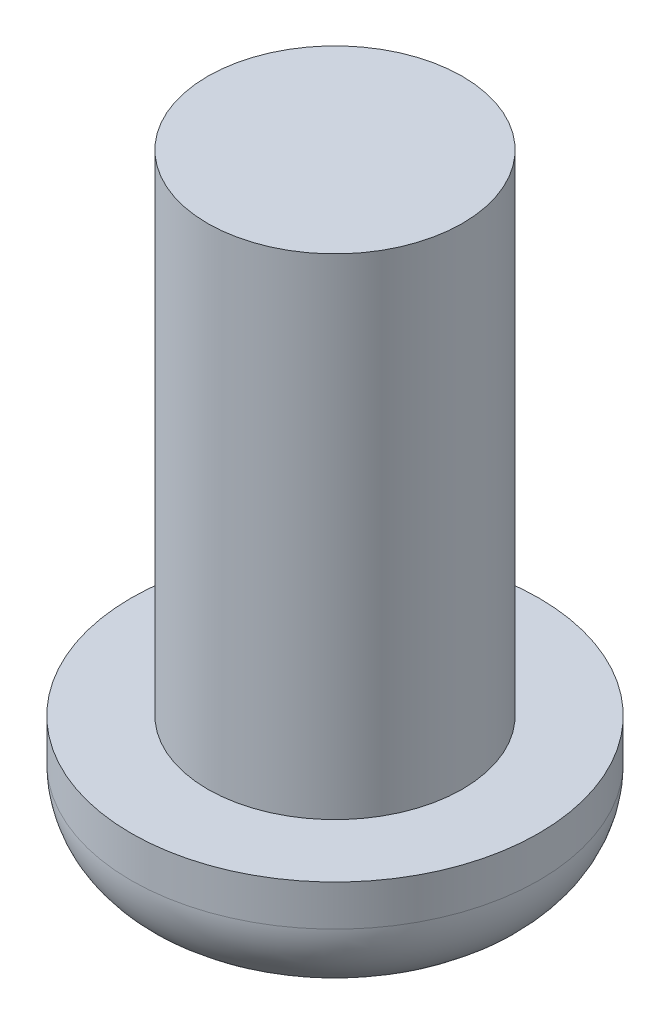
ISO-10303-21;
HEADER;
FILE_DESCRIPTION(('STEP AP214'),'2;1');
FILE_NAME('part.step','',(''),(''),'','','');
FILE_SCHEMA(('AUTOMOTIVE_DESIGN { 1 0 10303 214 1 1 1 1 }'));
ENDSEC;
DATA;
#1=APPLICATION_CONTEXT('core data for automotive mechanical design processes');
#2=APPLICATION_PROTOCOL_DEFINITION('international standard','automotive_design',2000,#1);
#3=PRODUCT_CONTEXT('',#1,'mechanical');
#4=PRODUCT('Part','Part','',(#3));
#5=PRODUCT_RELATED_PRODUCT_CATEGORY('part','',(#4));
#6=PRODUCT_DEFINITION_FORMATION('','',#4);
#7=PRODUCT_DEFINITION_CONTEXT('part definition',#1,'design');
#8=PRODUCT_DEFINITION('design','',#6,#7);
#9=PRODUCT_DEFINITION_SHAPE('','',#8);
#10=(LENGTH_UNIT() NAMED_UNIT(*) SI_UNIT(.MILLI.,.METRE.));
#11=(NAMED_UNIT(*) PLANE_ANGLE_UNIT() SI_UNIT($,.RADIAN.));
#12=(NAMED_UNIT(*) SI_UNIT($,.STERADIAN.) SOLID_ANGLE_UNIT());
#13=UNCERTAINTY_MEASURE_WITH_UNIT(LENGTH_MEASURE(1.E-05),#10,'distance_accuracy_value','');
#14=(GEOMETRIC_REPRESENTATION_CONTEXT(3) GLOBAL_UNCERTAINTY_ASSIGNED_CONTEXT((#13)) GLOBAL_UNIT_ASSIGNED_CONTEXT((#10,
#11,#12)) REPRESENTATION_CONTEXT('',''));
#15=CARTESIAN_POINT('',(0.,0.,0.));
#16=DIRECTION('',(0.,0.,1.));
#17=DIRECTION('',(1.,0.,0.));
#18=AXIS2_PLACEMENT_3D('',#15,#16,#17);
#19=CARTESIAN_POINT('',(0.,9.525,0.));
#20=DIRECTION('',(0.,-1.,0.));
#21=DIRECTION('',(0.,0.,-1.));
#22=AXIS2_PLACEMENT_3D('',#19,#20,#21);
#23=CYLINDRICAL_SURFACE('',#22,2.4765);
#24=CARTESIAN_POINT('',(0.,9.525,0.));
#25=DIRECTION('',(0.,1.,0.));
#26=DIRECTION('',(0.,0.,1.));
#27=AXIS2_PLACEMENT_3D('',#24,#25,#26);
#28=CIRCLE('',#27,2.4765);
#29=CARTESIAN_POINT('',(0.,9.525,-2.4765));
#30=VERTEX_POINT('',#29);
#31=EDGE_CURVE('E174',#30,#30,#28,.T.);
#32=CARTESIAN_POINT('',(0.,0.,0.));
#33=DIRECTION('',(0.,1.,0.));
#34=DIRECTION('',(0.,0.,1.));
#35=AXIS2_PLACEMENT_3D('',#32,#33,#34);
#36=CIRCLE('',#35,2.4765);
#37=CARTESIAN_POINT('',(0.,0.,-2.4765));
#38=VERTEX_POINT('',#37);
#39=EDGE_CURVE('E173',#38,#38,#36,.T.);
#40=CARTESIAN_POINT('',(0.,9.525,-2.4765));
#41=CARTESIAN_POINT('',(0.,9.42578125,-2.4765));
#42=CARTESIAN_POINT('',(0.,9.3265625,-2.4765));
#43=CARTESIAN_POINT('',(0.,9.128125,-2.4765));
#44=CARTESIAN_POINT('',(0.,9.02890625,-2.4765));
#45=CARTESIAN_POINT('',(0.,8.83046875,-2.4765));
#46=CARTESIAN_POINT('',(0.,8.73125,-2.4765));
#47=CARTESIAN_POINT('',(0.,8.5328125,-2.4765));
#48=CARTESIAN_POINT('',(0.,8.43359375,-2.4765));
#49=CARTESIAN_POINT('',(0.,8.23515625,-2.4765));
#50=CARTESIAN_POINT('',(0.,8.1359375,-2.4765));
#51=CARTESIAN_POINT('',(0.,7.9375,-2.4765));
#52=CARTESIAN_POINT('',(0.,7.83828125,-2.4765));
#53=CARTESIAN_POINT('',(0.,7.63984375,-2.4765));
#54=CARTESIAN_POINT('',(0.,7.540625,-2.4765));
#55=CARTESIAN_POINT('',(0.,7.3421875,-2.4765));
#56=CARTESIAN_POINT('',(0.,7.24296875,-2.4765));
#57=CARTESIAN_POINT('',(0.,7.04453125,-2.4765));
#58=CARTESIAN_POINT('',(0.,6.9453125,-2.4765));
#59=CARTESIAN_POINT('',(0.,6.746875,-2.4765));
#60=CARTESIAN_POINT('',(0.,6.64765625,-2.4765));
#61=CARTESIAN_POINT('',(0.,6.44921875,-2.4765));
#62=CARTESIAN_POINT('',(0.,6.35,-2.4765));
#63=CARTESIAN_POINT('',(0.,6.1515625,-2.4765));
#64=CARTESIAN_POINT('',(0.,6.05234375,-2.4765));
#65=CARTESIAN_POINT('',(0.,5.85390625,-2.4765));
#66=CARTESIAN_POINT('',(0.,5.7546875,-2.4765));
#67=CARTESIAN_POINT('',(0.,5.55625,-2.4765));
#68=CARTESIAN_POINT('',(0.,5.45703125,-2.4765));
#69=CARTESIAN_POINT('',(0.,5.25859375,-2.4765));
#70=CARTESIAN_POINT('',(0.,5.159375,-2.4765));
#71=CARTESIAN_POINT('',(0.,4.9609375,-2.4765));
#72=CARTESIAN_POINT('',(0.,4.86171875,-2.4765));
#73=CARTESIAN_POINT('',(0.,4.66328125,-2.4765));
#74=CARTESIAN_POINT('',(0.,4.5640625,-2.4765));
#75=CARTESIAN_POINT('',(0.,4.365625,-2.4765));
#76=CARTESIAN_POINT('',(0.,4.26640625,-2.4765));
#77=CARTESIAN_POINT('',(0.,4.06796875,-2.4765));
#78=CARTESIAN_POINT('',(0.,3.96875,-2.4765));
#79=CARTESIAN_POINT('',(0.,3.7703125,-2.4765));
#80=CARTESIAN_POINT('',(0.,3.67109375,-2.4765));
#81=CARTESIAN_POINT('',(0.,3.47265625,-2.4765));
#82=CARTESIAN_POINT('',(0.,3.3734375,-2.4765));
#83=CARTESIAN_POINT('',(0.,3.175,-2.4765));
#84=CARTESIAN_POINT('',(0.,3.07578125,-2.4765));
#85=CARTESIAN_POINT('',(0.,2.87734375,-2.4765));
#86=CARTESIAN_POINT('',(0.,2.778125,-2.4765));
#87=CARTESIAN_POINT('',(0.,2.5796875,-2.4765));
#88=CARTESIAN_POINT('',(0.,2.48046875,-2.4765));
#89=CARTESIAN_POINT('',(0.,2.28203125,-2.4765));
#90=CARTESIAN_POINT('',(0.,2.1828125,-2.4765));
#91=CARTESIAN_POINT('',(0.,1.984375,-2.4765));
#92=CARTESIAN_POINT('',(0.,1.88515625,-2.4765));
#93=CARTESIAN_POINT('',(0.,1.68671875,-2.4765));
#94=CARTESIAN_POINT('',(0.,1.5875,-2.4765));
#95=CARTESIAN_POINT('',(0.,1.3890625,-2.4765));
#96=CARTESIAN_POINT('',(0.,1.28984375,-2.4765));
#97=CARTESIAN_POINT('',(0.,1.09140625,-2.4765));
#98=CARTESIAN_POINT('',(0.,0.992187500000001,-2.4765));
#99=CARTESIAN_POINT('',(0.,0.793750000000001,-2.4765));
#100=CARTESIAN_POINT('',(0.,0.69453125,-2.4765));
#101=CARTESIAN_POINT('',(0.,0.49609375,-2.4765));
#102=CARTESIAN_POINT('',(0.,0.396875,-2.4765));
#103=CARTESIAN_POINT('',(0.,0.1984375,-2.4765));
#104=CARTESIAN_POINT('',(0.,0.0992187500000001,-2.4765));
#105=CARTESIAN_POINT('',(0.,0.,-2.4765));
#106=B_SPLINE_CURVE_WITH_KNOTS('',3,(#40,#41,#42,#43,#44,#45,#46,#47,#48,#49,#50,#51,#52,#53,
#54,#55,#56,#57,#58,#59,#60,#61,#62,#63,#64,#65,#66,#67,#68,#69,#70,#71,#72,#73,#74,#75,#76,#77,
#78,#79,#80,#81,#82,#83,#84,#85,#86,#87,#88,#89,#90,#91,#92,#93,#94,#95,#96,#97,#98,#99,#100,
#101,#102,#103,#104,#105),.UNSPECIFIED.,.F.,.F.,(4,2,2,2,2,2,2,2,2,2,2,2,2,2,2,2,2,2,2,2,2,2,2,
2,2,2,2,2,2,2,2,2,4),(0.,0.297656249999998,0.595312499999999,0.892968749999999,1.190625,
1.48828125,1.7859375,2.08359375,2.38125,2.67890625,2.9765625,3.27421875,3.571875,3.86953125,
4.1671875,4.46484375,4.7625,5.06015625,5.3578125,5.65546875,5.953125,6.25078125,6.5484375,
6.84609375,7.14375,7.44140625,7.7390625,8.03671875,8.334375,8.63203125,8.9296875,9.22734375,
9.525),.UNSPECIFIED.);
#107=EDGE_CURVE('BSEAM45',#30,#38,#106,.T.);
#108=ORIENTED_EDGE('',*,*,#31,.F.);
#109=ORIENTED_EDGE('',*,*,#39,.T.);
#110=ORIENTED_EDGE('',*,*,#107,.T.);
#111=ORIENTED_EDGE('',*,*,#107,.F.);
#112=EDGE_LOOP('',(#108,#110,#109,#111));
#113=FACE_BOUND('',#112,.T.);
#114=ADVANCED_FACE('F45',(#113),#23,.T.);
#115=CARTESIAN_POINT('',(0.,9.525,0.));
#116=DIRECTION('',(0.,1.,0.));
#117=DIRECTION('',(0.,0.,1.));
#118=AXIS2_PLACEMENT_3D('',#115,#116,#117);
#119=PLANE('',#118);
#120=ORIENTED_EDGE('',*,*,#31,.T.);
#121=EDGE_LOOP('',(#120));
#122=FACE_BOUND('',#121,.T.);
#123=ADVANCED_FACE('F197',(#122),#119,.T.);
#124=CARTESIAN_POINT('',(0.,-2.38125,0.));
#125=DIRECTION('',(0.,1.,0.));
#126=DIRECTION('',(0.,0.,1.));
#127=AXIS2_PLACEMENT_3D('',#124,#125,#126);
#128=CYLINDRICAL_SURFACE('',#127,3.9624);
#129=CARTESIAN_POINT('',(0.,-0.79375,0.));
#130=DIRECTION('',(0.,-1.,0.));
#131=DIRECTION('',(0.,0.,-1.));
#132=AXIS2_PLACEMENT_3D('',#129,#130,#131);
#133=CIRCLE('',#132,3.9624);
#134=CARTESIAN_POINT('',(0.,-0.79375,3.9624));
#135=VERTEX_POINT('',#134);
#136=EDGE_CURVE('E11',#135,#135,#133,.F.);
#137=CARTESIAN_POINT('',(0.,0.,0.));
#138=DIRECTION('',(0.,-1.,0.));
#139=DIRECTION('',(0.,0.,-1.));
#140=AXIS2_PLACEMENT_3D('',#137,#138,#139);
#141=CIRCLE('',#140,3.9624);
#142=CARTESIAN_POINT('',(0.,0.,3.9624));
#143=VERTEX_POINT('',#142);
#144=EDGE_CURVE('E160',#143,#143,#141,.T.);
#145=CARTESIAN_POINT('',(0.,-0.79375,3.9624));
#146=CARTESIAN_POINT('',(0.,-0.785481770833333,3.9624));
#147=CARTESIAN_POINT('',(0.,-0.777213541666666,3.9624));
#148=CARTESIAN_POINT('',(0.,-0.760677083333333,3.9624));
#149=CARTESIAN_POINT('',(0.,-0.752408854166666,3.9624));
#150=CARTESIAN_POINT('',(0.,-0.735872395833333,3.9624));
#151=CARTESIAN_POINT('',(0.,-0.727604166666666,3.9624));
#152=CARTESIAN_POINT('',(0.,-0.711067708333333,3.9624));
#153=CARTESIAN_POINT('',(0.,-0.702799479166666,3.9624));
#154=CARTESIAN_POINT('',(0.,-0.686263020833333,3.9624));
#155=CARTESIAN_POINT('',(0.,-0.677994791666666,3.9624));
#156=CARTESIAN_POINT('',(0.,-0.661458333333333,3.9624));
#157=CARTESIAN_POINT('',(0.,-0.653190104166666,3.9624));
#158=CARTESIAN_POINT('',(0.,-0.636653645833333,3.9624));
#159=CARTESIAN_POINT('',(0.,-0.628385416666666,3.9624));
#160=CARTESIAN_POINT('',(0.,-0.611848958333333,3.9624));
#161=CARTESIAN_POINT('',(0.,-0.603580729166666,3.9624));
#162=CARTESIAN_POINT('',(0.,-0.587044270833333,3.9624));
#163=CARTESIAN_POINT('',(0.,-0.578776041666666,3.9624));
#164=CARTESIAN_POINT('',(0.,-0.562239583333333,3.9624));
#165=CARTESIAN_POINT('',(0.,-0.553971354166666,3.9624));
#166=CARTESIAN_POINT('',(0.,-0.537434895833333,3.9624));
#167=CARTESIAN_POINT('',(0.,-0.529166666666666,3.9624));
#168=CARTESIAN_POINT('',(0.,-0.512630208333333,3.9624));
#169=CARTESIAN_POINT('',(0.,-0.504361979166666,3.9624));
#170=CARTESIAN_POINT('',(0.,-0.487825520833333,3.9624));
#171=CARTESIAN_POINT('',(0.,-0.479557291666666,3.9624));
#172=CARTESIAN_POINT('',(0.,-0.463020833333333,3.9624));
#173=CARTESIAN_POINT('',(0.,-0.454752604166666,3.9624));
#174=CARTESIAN_POINT('',(0.,-0.438216145833333,3.9624));
#175=CARTESIAN_POINT('',(0.,-0.429947916666667,3.9624));
#176=CARTESIAN_POINT('',(0.,-0.413411458333333,3.9624));
#177=CARTESIAN_POINT('',(0.,-0.405143229166666,3.9624));
#178=CARTESIAN_POINT('',(0.,-0.388606770833333,3.9624));
#179=CARTESIAN_POINT('',(0.,-0.380338541666666,3.9624));
#180=CARTESIAN_POINT('',(0.,-0.363802083333333,3.9624));
#181=CARTESIAN_POINT('',(0.,-0.355533854166667,3.9624));
#182=CARTESIAN_POINT('',(0.,-0.338997395833333,3.9624));
#183=CARTESIAN_POINT('',(0.,-0.330729166666667,3.9624));
#184=CARTESIAN_POINT('',(0.,-0.314192708333333,3.9624));
#185=CARTESIAN_POINT('',(0.,-0.305924479166667,3.9624));
#186=CARTESIAN_POINT('',(0.,-0.289388020833333,3.9624));
#187=CARTESIAN_POINT('',(0.,-0.281119791666667,3.9624));
#188=CARTESIAN_POINT('',(0.,-0.264583333333333,3.9624));
#189=CARTESIAN_POINT('',(0.,-0.256315104166667,3.9624));
#190=CARTESIAN_POINT('',(0.,-0.239778645833333,3.9624));
#191=CARTESIAN_POINT('',(0.,-0.231510416666667,3.9624));
#192=CARTESIAN_POINT('',(0.,-0.214973958333333,3.9624));
#193=CARTESIAN_POINT('',(0.,-0.206705729166667,3.9624));
#194=CARTESIAN_POINT('',(0.,-0.190169270833333,3.9624));
#195=CARTESIAN_POINT('',(0.,-0.181901041666667,3.9624));
#196=CARTESIAN_POINT('',(0.,-0.165364583333333,3.9624));
#197=CARTESIAN_POINT('',(0.,-0.157096354166667,3.9624));
#198=CARTESIAN_POINT('',(0.,-0.140559895833333,3.9624));
#199=CARTESIAN_POINT('',(0.,-0.132291666666667,3.9624));
#200=CARTESIAN_POINT('',(0.,-0.115755208333333,3.9624));
#201=CARTESIAN_POINT('',(0.,-0.107486979166667,3.9624));
#202=CARTESIAN_POINT('',(0.,-0.0909505208333333,3.9624));
#203=CARTESIAN_POINT('',(0.,-0.0826822916666667,3.9624));
#204=CARTESIAN_POINT('',(0.,-0.0661458333333333,3.9624));
#205=CARTESIAN_POINT('',(0.,-0.0578776041666665,3.9624));
#206=CARTESIAN_POINT('',(0.,-0.0413411458333331,3.9624));
#207=CARTESIAN_POINT('',(0.,-0.0330729166666665,3.9624));
#208=CARTESIAN_POINT('',(0.,-0.0165364583333332,3.9624));
#209=CARTESIAN_POINT('',(0.,-0.00826822916666662,3.9624));
#210=CARTESIAN_POINT('',(0.,0.,3.9624));
#211=B_SPLINE_CURVE_WITH_KNOTS('',3,(#145,#146,#147,#148,#149,#150,#151,#152,#153,#154,#155,
#156,#157,#158,#159,#160,#161,#162,#163,#164,#165,#166,#167,#168,#169,#170,#171,#172,#173,#174,
#175,#176,#177,#178,#179,#180,#181,#182,#183,#184,#185,#186,#187,#188,#189,#190,#191,#192,#193,
#194,#195,#196,#197,#198,#199,#200,#201,#202,#203,#204,#205,#206,#207,#208,#209,#210),
.UNSPECIFIED.,.F.,.F.,(4,2,2,2,2,2,2,2,2,2,2,2,2,2,2,2,2,2,2,2,2,2,2,2,2,2,2,2,2,2,2,2,4),(0.,
0.0248046875000001,0.049609375,0.0744140625,0.0992187499999999,0.1240234375,0.148828125,
0.1736328125,0.1984375,0.2232421875,0.248046875,0.2728515625,0.29765625,0.3224609375,
0.347265625,0.3720703125,0.396875,0.4216796875,0.446484375,0.471289062499999,0.496093749999999,
0.5208984375,0.545703125,0.570507812499999,0.5953125,0.6201171875,0.644921874999999,
0.6697265625,0.69453125,0.719335937499999,0.744140625,0.7689453125,0.79375),.UNSPECIFIED.);
#212=EDGE_CURVE('BSEAM202',#135,#143,#211,.T.);
#213=ORIENTED_EDGE('',*,*,#136,.T.);
#214=ORIENTED_EDGE('',*,*,#144,.T.);
#215=ORIENTED_EDGE('',*,*,#212,.T.);
#216=ORIENTED_EDGE('',*,*,#212,.F.);
#217=EDGE_LOOP('',(#213,#215,#214,#216));
#218=FACE_BOUND('',#217,.T.);
#219=ADVANCED_FACE('F202',(#218),#128,.T.);
#220=CARTESIAN_POINT('',(0.,-2.38125,0.));
#221=DIRECTION('',(0.,-1.,0.));
#222=DIRECTION('',(0.,0.,-1.));
#223=AXIS2_PLACEMENT_3D('',#220,#221,#222);
#224=PLANE('',#223);
#225=CARTESIAN_POINT('',(0.,-2.38125,0.));
#226=DIRECTION('',(0.,-1.,0.));
#227=DIRECTION('',(0.,0.,-1.));
#228=AXIS2_PLACEMENT_3D('',#225,#226,#227);
#229=CIRCLE('',#228,2.3749);
#230=CARTESIAN_POINT('',(0.,-2.38125,-2.3749));
#231=VERTEX_POINT('',#230);
#232=EDGE_CURVE('E54',#231,#231,#229,.T.);
#233=ORIENTED_EDGE('',*,*,#232,.T.);
#234=EDGE_LOOP('',(#233));
#235=FACE_BOUND('',#234,.T.);
#236=DIRECTION('',(0.5,0.,0.866025403784439));
#237=VECTOR('',#236,1.);
#238=CARTESIAN_POINT('',(1.03111149638085,-2.38125,-1.7859375));
#239=LINE('',#238,#237);
#240=CARTESIAN_POINT('',(1.03111149638085,-2.38125,-1.7859375));
#241=VERTEX_POINT('',#240);
#242=CARTESIAN_POINT('',(2.06222299276169,-2.38125,0.));
#243=VERTEX_POINT('',#242);
#244=EDGE_CURVE('E61',#241,#243,#239,.T.);
#245=ORIENTED_EDGE('',*,*,#244,.F.);
#246=DIRECTION('',(1.,0.,0.));
#247=VECTOR('',#246,1.);
#248=CARTESIAN_POINT('',(-1.03111149638085,-2.38125,-1.7859375));
#249=LINE('',#248,#247);
#250=CARTESIAN_POINT('',(-1.03111149638085,-2.38125,-1.7859375));
#251=VERTEX_POINT('',#250);
#252=EDGE_CURVE('E154',#251,#241,#249,.T.);
#253=ORIENTED_EDGE('',*,*,#252,.F.);
#254=DIRECTION('',(0.5,0.,-0.866025403784439));
#255=VECTOR('',#254,1.);
#256=CARTESIAN_POINT('',(-2.06222299276169,-2.38125,0.));
#257=LINE('',#256,#255);
#258=CARTESIAN_POINT('',(-2.06222299276169,-2.38125,0.));
#259=VERTEX_POINT('',#258);
#260=EDGE_CURVE('E151',#259,#251,#257,.T.);
#261=ORIENTED_EDGE('',*,*,#260,.F.);
#262=DIRECTION('',(-0.5,0.,-0.866025403784439));
#263=VECTOR('',#262,1.);
#264=CARTESIAN_POINT('',(-1.03111149638085,-2.38125,1.7859375));
#265=LINE('',#264,#263);
#266=CARTESIAN_POINT('',(-1.03111149638085,-2.38125,1.7859375));
#267=VERTEX_POINT('',#266);
#268=EDGE_CURVE('E109',#267,#259,#265,.T.);
#269=ORIENTED_EDGE('',*,*,#268,.F.);
#270=DIRECTION('',(-1.,0.,0.));
#271=VECTOR('',#270,1.);
#272=CARTESIAN_POINT('',(1.03111149638085,-2.38125,1.7859375));
#273=LINE('',#272,#271);
#274=CARTESIAN_POINT('',(1.03111149638085,-2.38125,1.7859375));
#275=VERTEX_POINT('',#274);
#276=EDGE_CURVE('E145',#275,#267,#273,.T.);
#277=ORIENTED_EDGE('',*,*,#276,.F.);
#278=DIRECTION('',(-0.5,0.,0.866025403784439));
#279=VECTOR('',#278,1.);
#280=CARTESIAN_POINT('',(2.06222299276169,-2.38125,0.));
#281=LINE('',#280,#279);
#282=EDGE_CURVE('E141',#243,#275,#281,.T.);
#283=ORIENTED_EDGE('',*,*,#282,.F.);
#284=EDGE_LOOP('',(#245,#253,#261,#269,#277,#283));
#285=FACE_BOUND('',#284,.T.);
#286=ADVANCED_FACE('F184',(#235,#285),#224,.T.);
#287=CARTESIAN_POINT('',(0.,0.,0.));
#288=DIRECTION('',(0.,-1.,0.));
#289=DIRECTION('',(0.,0.,-1.));
#290=AXIS2_PLACEMENT_3D('',#287,#288,#289);
#291=PLANE('',#290);
#292=ORIENTED_EDGE('',*,*,#39,.F.);
#293=EDGE_LOOP('',(#292));
#294=FACE_BOUND('',#293,.T.);
#295=ORIENTED_EDGE('',*,*,#144,.F.);
#296=EDGE_LOOP('',(#295));
#297=FACE_BOUND('',#296,.T.);
#298=ADVANCED_FACE('F211',(#294,#297),#291,.F.);
#299=CARTESIAN_POINT('',(1.03111149638085,-0.0952500000000003,-1.7859375));
#300=DIRECTION('',(0.866025403784439,0.,-0.5));
#301=DIRECTION('',(-0.5,0.,-0.866025403784439));
#302=AXIS2_PLACEMENT_3D('',#299,#300,#301);
#303=PLANE('',#302);
#304=ORIENTED_EDGE('',*,*,#244,.T.);
#305=DIRECTION('',(0.,-1.,0.));
#306=VECTOR('',#305,1.);
#307=CARTESIAN_POINT('',(2.06222299276169,-0.0952500000000003,0.));
#308=LINE('',#307,#306);
#309=CARTESIAN_POINT('',(2.06222299276169,-0.0952500000000003,0.));
#310=VERTEX_POINT('',#309);
#311=EDGE_CURVE('E91',#310,#243,#308,.T.);
#312=ORIENTED_EDGE('',*,*,#311,.F.);
#313=DIRECTION('',(0.5,0.,0.866025403784439));
#314=VECTOR('',#313,1.);
#315=CARTESIAN_POINT('',(1.03111149638085,-0.0952500000000003,-1.7859375));
#316=LINE('',#315,#314);
#317=CARTESIAN_POINT('',(1.03111149638085,-0.0952500000000003,-1.7859375));
#318=VERTEX_POINT('',#317);
#319=EDGE_CURVE('E157',#318,#310,#316,.T.);
#320=ORIENTED_EDGE('',*,*,#319,.F.);
#321=DIRECTION('',(0.,-1.,0.));
#322=VECTOR('',#321,1.);
#323=CARTESIAN_POINT('',(1.03111149638085,-0.0952500000000003,-1.7859375));
#324=LINE('',#323,#322);
#325=EDGE_CURVE('E69',#318,#241,#324,.T.);
#326=ORIENTED_EDGE('',*,*,#325,.T.);
#327=EDGE_LOOP('',(#304,#312,#320,#326));
#328=FACE_BOUND('',#327,.T.);
#329=ADVANCED_FACE('F214',(#328),#303,.F.);
#330=CARTESIAN_POINT('',(-1.03111149638085,-0.0952500000000003,-1.7859375));
#331=DIRECTION('',(0.,0.,-1.));
#332=DIRECTION('',(-1.,0.,0.));
#333=AXIS2_PLACEMENT_3D('',#330,#331,#332);
#334=PLANE('',#333);
#335=ORIENTED_EDGE('',*,*,#252,.T.);
#336=ORIENTED_EDGE('',*,*,#325,.F.);
#337=DIRECTION('',(1.,0.,0.));
#338=VECTOR('',#337,1.);
#339=CARTESIAN_POINT('',(-1.03111149638085,-0.0952500000000003,-1.7859375));
#340=LINE('',#339,#338);
#341=CARTESIAN_POINT('',(-1.03111149638085,-0.0952500000000003,-1.7859375));
#342=VERTEX_POINT('',#341);
#343=EDGE_CURVE('E123',#342,#318,#340,.T.);
#344=ORIENTED_EDGE('',*,*,#343,.F.);
#345=DIRECTION('',(0.,-1.,0.));
#346=VECTOR('',#345,1.);
#347=CARTESIAN_POINT('',(-1.03111149638085,-0.0952500000000003,-1.7859375));
#348=LINE('',#347,#346);
#349=EDGE_CURVE('E114',#342,#251,#348,.T.);
#350=ORIENTED_EDGE('',*,*,#349,.T.);
#351=EDGE_LOOP('',(#335,#336,#344,#350));
#352=FACE_BOUND('',#351,.T.);
#353=ADVANCED_FACE('F219',(#352),#334,.F.);
#354=CARTESIAN_POINT('',(-2.06222299276169,-0.0952500000000003,0.));
#355=DIRECTION('',(-0.866025403784439,0.,-0.5));
#356=DIRECTION('',(-0.5,0.,0.866025403784439));
#357=AXIS2_PLACEMENT_3D('',#354,#355,#356);
#358=PLANE('',#357);
#359=ORIENTED_EDGE('',*,*,#260,.T.);
#360=ORIENTED_EDGE('',*,*,#349,.F.);
#361=DIRECTION('',(0.5,0.,-0.866025403784439));
#362=VECTOR('',#361,1.);
#363=CARTESIAN_POINT('',(-2.06222299276169,-0.0952500000000003,0.));
#364=LINE('',#363,#362);
#365=CARTESIAN_POINT('',(-2.06222299276169,-0.0952500000000003,0.));
#366=VERTEX_POINT('',#365);
#367=EDGE_CURVE('E118',#366,#342,#364,.T.);
#368=ORIENTED_EDGE('',*,*,#367,.F.);
#369=DIRECTION('',(0.,-1.,0.));
#370=VECTOR('',#369,1.);
#371=CARTESIAN_POINT('',(-2.06222299276169,-0.0952500000000003,0.));
#372=LINE('',#371,#370);
#373=EDGE_CURVE('E102',#366,#259,#372,.T.);
#374=ORIENTED_EDGE('',*,*,#373,.T.);
#375=EDGE_LOOP('',(#359,#360,#368,#374));
#376=FACE_BOUND('',#375,.T.);
#377=ADVANCED_FACE('F119',(#376),#358,.F.);
#378=CARTESIAN_POINT('',(-1.03111149638085,-0.0952500000000003,1.7859375));
#379=DIRECTION('',(-0.866025403784438,0.,0.5));
#380=DIRECTION('',(0.5,0.,0.866025403784439));
#381=AXIS2_PLACEMENT_3D('',#378,#379,#380);
#382=PLANE('',#381);
#383=ORIENTED_EDGE('',*,*,#268,.T.);
#384=ORIENTED_EDGE('',*,*,#373,.F.);
#385=DIRECTION('',(-0.5,0.,-0.866025403784439));
#386=VECTOR('',#385,1.);
#387=CARTESIAN_POINT('',(-1.03111149638085,-0.0952500000000003,1.7859375));
#388=LINE('',#387,#386);
#389=CARTESIAN_POINT('',(-1.03111149638085,-0.0952500000000003,1.7859375));
#390=VERTEX_POINT('',#389);
#391=EDGE_CURVE('E106',#390,#366,#388,.T.);
#392=ORIENTED_EDGE('',*,*,#391,.F.);
#393=DIRECTION('',(0.,-1.,0.));
#394=VECTOR('',#393,1.);
#395=CARTESIAN_POINT('',(-1.03111149638085,-0.0952500000000003,1.7859375));
#396=LINE('',#395,#394);
#397=EDGE_CURVE('E115',#390,#267,#396,.T.);
#398=ORIENTED_EDGE('',*,*,#397,.T.);
#399=EDGE_LOOP('',(#383,#384,#392,#398));
#400=FACE_BOUND('',#399,.T.);
#401=ADVANCED_FACE('F104',(#400),#382,.F.);
#402=CARTESIAN_POINT('',(1.03111149638085,-0.0952500000000003,1.7859375));
#403=DIRECTION('',(0.,0.,1.));
#404=DIRECTION('',(1.,0.,0.));
#405=AXIS2_PLACEMENT_3D('',#402,#403,#404);
#406=PLANE('',#405);
#407=ORIENTED_EDGE('',*,*,#276,.T.);
#408=ORIENTED_EDGE('',*,*,#397,.F.);
#409=DIRECTION('',(-1.,0.,0.));
#410=VECTOR('',#409,1.);
#411=CARTESIAN_POINT('',(1.03111149638085,-0.0952500000000003,1.7859375));
#412=LINE('',#411,#410);
#413=CARTESIAN_POINT('',(1.03111149638085,-0.0952500000000003,1.7859375));
#414=VERTEX_POINT('',#413);
#415=EDGE_CURVE('E129',#414,#390,#412,.T.);
#416=ORIENTED_EDGE('',*,*,#415,.F.);
#417=DIRECTION('',(0.,-1.,0.));
#418=VECTOR('',#417,1.);
#419=CARTESIAN_POINT('',(1.03111149638085,-0.0952500000000003,1.7859375));
#420=LINE('',#419,#418);
#421=EDGE_CURVE('E165',#414,#275,#420,.T.);
#422=ORIENTED_EDGE('',*,*,#421,.T.);
#423=EDGE_LOOP('',(#407,#408,#416,#422));
#424=FACE_BOUND('',#423,.T.);
#425=ADVANCED_FACE('F222',(#424),#406,.F.);
#426=CARTESIAN_POINT('',(2.06222299276169,-0.0952500000000003,0.));
#427=DIRECTION('',(0.866025403784439,0.,0.5));
#428=DIRECTION('',(0.5,0.,-0.866025403784439));
#429=AXIS2_PLACEMENT_3D('',#426,#427,#428);
#430=PLANE('',#429);
#431=ORIENTED_EDGE('',*,*,#282,.T.);
#432=ORIENTED_EDGE('',*,*,#421,.F.);
#433=DIRECTION('',(-0.5,0.,0.866025403784439));
#434=VECTOR('',#433,1.);
#435=CARTESIAN_POINT('',(2.06222299276169,-0.0952500000000003,0.));
#436=LINE('',#435,#434);
#437=EDGE_CURVE('E133',#310,#414,#436,.T.);
#438=ORIENTED_EDGE('',*,*,#437,.F.);
#439=ORIENTED_EDGE('',*,*,#311,.T.);
#440=EDGE_LOOP('',(#431,#432,#438,#439));
#441=FACE_BOUND('',#440,.T.);
#442=ADVANCED_FACE('F193',(#441),#430,.F.);
#443=CARTESIAN_POINT('',(0.,-0.0952500000000003,0.));
#444=DIRECTION('',(0.,-1.,0.));
#445=DIRECTION('',(0.,0.,-1.));
#446=AXIS2_PLACEMENT_3D('',#443,#444,#445);
#447=PLANE('',#446);
#448=ORIENTED_EDGE('',*,*,#319,.T.);
#449=ORIENTED_EDGE('',*,*,#437,.T.);
#450=ORIENTED_EDGE('',*,*,#415,.T.);
#451=ORIENTED_EDGE('',*,*,#391,.T.);
#452=ORIENTED_EDGE('',*,*,#367,.T.);
#453=ORIENTED_EDGE('',*,*,#343,.T.);
#454=EDGE_LOOP('',(#448,#449,#450,#451,#452,#453));
#455=FACE_BOUND('',#454,.T.);
#456=ADVANCED_FACE('F126',(#455),#447,.T.);
#457=CARTESIAN_POINT('',(0.,-0.79375,0.));
#458=DIRECTION('',(0.,-1.,0.));
#459=DIRECTION('',(0.,0.,-1.));
#460=AXIS2_PLACEMENT_3D('',#457,#458,#459);
#461=TOROIDAL_SURFACE('',#460,2.3749,1.5875);
#462=ORIENTED_EDGE('',*,*,#136,.F.);
#463=EDGE_LOOP('',(#462));
#464=FACE_BOUND('',#463,.T.);
#465=ORIENTED_EDGE('',*,*,#232,.F.);
#466=EDGE_LOOP('',(#465));
#467=FACE_BOUND('',#466,.T.);
#468=ADVANCED_FACE('F47',(#464,#467),#461,.T.);
#469=CLOSED_SHELL('',(#114,#123,#219,#286,#298,#329,#353,#377,#401,#425,#442,#456,#468));
#470=MANIFOLD_SOLID_BREP('B2',#469);
#471=ADVANCED_BREP_SHAPE_REPRESENTATION('',(#18,#470),#14);
#472=SHAPE_DEFINITION_REPRESENTATION(#9,#471);
ENDSEC;
END-ISO-10303-21;
